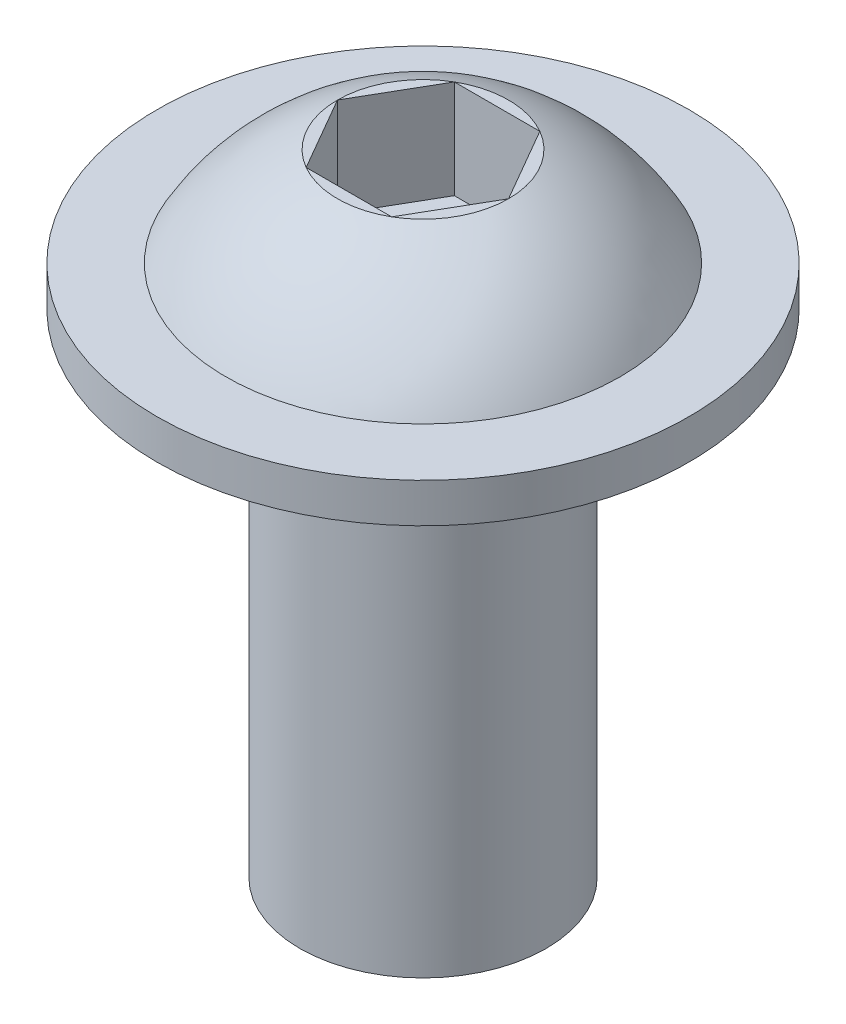
ISO-10303-21;
HEADER;
FILE_DESCRIPTION(('STEP AP214'),'2;1');
FILE_NAME('part.step','',(''),(''),'','','');
FILE_SCHEMA(('AUTOMOTIVE_DESIGN { 1 0 10303 214 1 1 1 1 }'));
ENDSEC;
DATA;
#1=APPLICATION_CONTEXT('core data for automotive mechanical design processes');
#2=APPLICATION_PROTOCOL_DEFINITION('international standard','automotive_design',2000,#1);
#3=PRODUCT_CONTEXT('',#1,'mechanical');
#4=PRODUCT('Part','Part','',(#3));
#5=PRODUCT_RELATED_PRODUCT_CATEGORY('part','',(#4));
#6=PRODUCT_DEFINITION_FORMATION('','',#4);
#7=PRODUCT_DEFINITION_CONTEXT('part definition',#1,'design');
#8=PRODUCT_DEFINITION('design','',#6,#7);
#9=PRODUCT_DEFINITION_SHAPE('','',#8);
#10=(LENGTH_UNIT() NAMED_UNIT(*) SI_UNIT(.MILLI.,.METRE.));
#11=(NAMED_UNIT(*) PLANE_ANGLE_UNIT() SI_UNIT($,.RADIAN.));
#12=(NAMED_UNIT(*) SI_UNIT($,.STERADIAN.) SOLID_ANGLE_UNIT());
#13=UNCERTAINTY_MEASURE_WITH_UNIT(LENGTH_MEASURE(1.E-05),#10,'distance_accuracy_value','');
#14=(GEOMETRIC_REPRESENTATION_CONTEXT(3) GLOBAL_UNCERTAINTY_ASSIGNED_CONTEXT((#13)) GLOBAL_UNIT_ASSIGNED_CONTEXT((#10,
#11,#12)) REPRESENTATION_CONTEXT('',''));
#15=CARTESIAN_POINT('',(0.,0.,0.));
#16=DIRECTION('',(0.,0.,1.));
#17=DIRECTION('',(1.,0.,0.));
#18=AXIS2_PLACEMENT_3D('',#15,#16,#17);
#19=CARTESIAN_POINT('',(2.7569630054343,20.32,0.));
#20=DIRECTION('',(0.,1.,0.));
#21=DIRECTION('',(0.,0.,1.));
#22=AXIS2_PLACEMENT_3D('',#19,#20,#21);
#23=PLANE('',#22);
#24=DIRECTION('',(0.5,0.,-0.866025403784439));
#25=VECTOR('',#24,1.);
#26=CARTESIAN_POINT('',(1.37848150271715,20.32,2.3876));
#27=LINE('',#26,#25);
#28=CARTESIAN_POINT('',(1.37848150271715,20.32,2.3876));
#29=VERTEX_POINT('',#28);
#30=CARTESIAN_POINT('',(2.7569630054343,20.32,0.));
#31=VERTEX_POINT('',#30);
#32=EDGE_CURVE('E47',#29,#31,#27,.T.);
#33=ORIENTED_EDGE('',*,*,#32,.F.);
#34=CARTESIAN_POINT('',(0.,20.32,0.));
#35=DIRECTION('',(0.,-1.,0.));
#36=DIRECTION('',(0.,0.,-1.));
#37=AXIS2_PLACEMENT_3D('',#34,#35,#36);
#38=CIRCLE('',#37,2.7569630054343);
#39=EDGE_CURVE('E144',#31,#29,#38,.T.);
#40=ORIENTED_EDGE('',*,*,#39,.F.);
#41=EDGE_LOOP('',(#33,#40));
#42=FACE_BOUND('',#41,.T.);
#43=ADVANCED_FACE('F32',(#42),#23,.T.);
#44=DIRECTION('',(1.,0.,0.));
#45=VECTOR('',#44,1.);
#46=CARTESIAN_POINT('',(-1.37848150271715,20.32,2.3876));
#47=LINE('',#46,#45);
#48=CARTESIAN_POINT('',(-1.37848150271715,20.32,2.3876));
#49=VERTEX_POINT('',#48);
#50=EDGE_CURVE('E130',#49,#29,#47,.T.);
#51=ORIENTED_EDGE('',*,*,#50,.F.);
#52=EDGE_CURVE('E218',#29,#49,#38,.T.);
#53=ORIENTED_EDGE('',*,*,#52,.F.);
#54=EDGE_LOOP('',(#51,#53));
#55=FACE_BOUND('',#54,.T.);
#56=ADVANCED_FACE('F171',(#55),#23,.T.);
#57=DIRECTION('',(0.5,0.,0.866025403784438));
#58=VECTOR('',#57,1.);
#59=CARTESIAN_POINT('',(-2.7569630054343,20.32,0.));
#60=LINE('',#59,#58);
#61=CARTESIAN_POINT('',(-2.7569630054343,20.32,0.));
#62=VERTEX_POINT('',#61);
#63=EDGE_CURVE('E128',#62,#49,#60,.T.);
#64=ORIENTED_EDGE('',*,*,#63,.F.);
#65=EDGE_CURVE('E219',#49,#62,#38,.T.);
#66=ORIENTED_EDGE('',*,*,#65,.F.);
#67=EDGE_LOOP('',(#64,#66));
#68=FACE_BOUND('',#67,.T.);
#69=ADVANCED_FACE('F178',(#68),#23,.T.);
#70=DIRECTION('',(-0.499999999999999,0.,0.866025403784439));
#71=VECTOR('',#70,1.);
#72=CARTESIAN_POINT('',(-1.37848150271715,20.32,-2.3876));
#73=LINE('',#72,#71);
#74=CARTESIAN_POINT('',(-1.37848150271715,20.32,-2.3876));
#75=VERTEX_POINT('',#74);
#76=EDGE_CURVE('E95',#75,#62,#73,.T.);
#77=ORIENTED_EDGE('',*,*,#76,.F.);
#78=EDGE_CURVE('E213',#62,#75,#38,.T.);
#79=ORIENTED_EDGE('',*,*,#78,.F.);
#80=EDGE_LOOP('',(#77,#79));
#81=FACE_BOUND('',#80,.T.);
#82=ADVANCED_FACE('F195',(#81),#23,.T.);
#83=DIRECTION('',(-1.,0.,0.));
#84=VECTOR('',#83,1.);
#85=CARTESIAN_POINT('',(1.37848150271715,20.32,-2.3876));
#86=LINE('',#85,#84);
#87=CARTESIAN_POINT('',(1.37848150271715,20.32,-2.3876));
#88=VERTEX_POINT('',#87);
#89=EDGE_CURVE('E124',#88,#75,#86,.T.);
#90=ORIENTED_EDGE('',*,*,#89,.F.);
#91=EDGE_CURVE('E134',#75,#88,#38,.T.);
#92=ORIENTED_EDGE('',*,*,#91,.F.);
#93=EDGE_LOOP('',(#90,#92));
#94=FACE_BOUND('',#93,.T.);
#95=ADVANCED_FACE('F186',(#94),#23,.T.);
#96=CARTESIAN_POINT('',(0.,0.,0.));
#97=DIRECTION('',(0.,-1.,0.));
#98=DIRECTION('',(0.,0.,-1.));
#99=AXIS2_PLACEMENT_3D('',#96,#97,#98);
#100=PLANE('',#99);
#101=CARTESIAN_POINT('',(0.,0.,0.));
#102=DIRECTION('',(0.,-1.,0.));
#103=DIRECTION('',(0.,0.,-1.));
#104=AXIS2_PLACEMENT_3D('',#101,#102,#103);
#105=CIRCLE('',#104,3.96875);
#106=CARTESIAN_POINT('',(0.,0.,-3.96875));
#107=VERTEX_POINT('',#106);
#108=EDGE_CURVE('E11',#107,#107,#105,.T.);
#109=ORIENTED_EDGE('',*,*,#108,.T.);
#110=EDGE_LOOP('',(#109));
#111=FACE_BOUND('',#110,.T.);
#112=ADVANCED_FACE('F34',(#111),#100,.T.);
#113=CARTESIAN_POINT('',(0.,0.,0.));
#114=DIRECTION('',(0.,-1.,0.));
#115=DIRECTION('',(0.,0.,-1.));
#116=AXIS2_PLACEMENT_3D('',#113,#114,#115);
#117=CYLINDRICAL_SURFACE('',#116,3.96875);
#118=CARTESIAN_POINT('',(0.,15.875,0.));
#119=DIRECTION('',(0.,-1.,0.));
#120=DIRECTION('',(0.,0.,-1.));
#121=AXIS2_PLACEMENT_3D('',#118,#119,#120);
#122=CIRCLE('',#121,3.96875);
#123=CARTESIAN_POINT('',(0.,15.875,-3.96875));
#124=VERTEX_POINT('',#123);
#125=EDGE_CURVE('E40',#124,#124,#122,.T.);
#126=ORIENTED_EDGE('',*,*,#125,.T.);
#127=EDGE_LOOP('',(#126));
#128=FACE_BOUND('',#127,.T.);
#129=ORIENTED_EDGE('',*,*,#108,.F.);
#130=EDGE_LOOP('',(#129));
#131=FACE_BOUND('',#130,.T.);
#132=ADVANCED_FACE('F155',(#128,#131),#117,.T.);
#133=CARTESIAN_POINT('',(3.96875,15.875,0.));
#134=DIRECTION('',(0.,-1.,0.));
#135=DIRECTION('',(0.,0.,-1.));
#136=AXIS2_PLACEMENT_3D('',#133,#134,#135);
#137=PLANE('',#136);
#138=CARTESIAN_POINT('',(0.,15.875,0.));
#139=DIRECTION('',(0.,-1.,0.));
#140=DIRECTION('',(0.,0.,-1.));
#141=AXIS2_PLACEMENT_3D('',#138,#139,#140);
#142=CIRCLE('',#141,8.5725);
#143=CARTESIAN_POINT('',(0.,15.875,-8.5725));
#144=VERTEX_POINT('',#143);
#145=EDGE_CURVE('E150',#144,#144,#142,.T.);
#146=ORIENTED_EDGE('',*,*,#145,.T.);
#147=EDGE_LOOP('',(#146));
#148=FACE_BOUND('',#147,.T.);
#149=ORIENTED_EDGE('',*,*,#125,.F.);
#150=EDGE_LOOP('',(#149));
#151=FACE_BOUND('',#150,.T.);
#152=ADVANCED_FACE('F158',(#148,#151),#137,.T.);
#153=CARTESIAN_POINT('',(0.,0.,0.));
#154=DIRECTION('',(0.,-1.,0.));
#155=DIRECTION('',(0.,0.,-1.));
#156=AXIS2_PLACEMENT_3D('',#153,#154,#155);
#157=CYLINDRICAL_SURFACE('',#156,8.5725);
#158=CARTESIAN_POINT('',(0.,17.145,0.));
#159=DIRECTION('',(0.,-1.,0.));
#160=DIRECTION('',(0.,0.,-1.));
#161=AXIS2_PLACEMENT_3D('',#158,#159,#160);
#162=CIRCLE('',#161,8.5725);
#163=CARTESIAN_POINT('',(0.,17.145,-8.5725));
#164=VERTEX_POINT('',#163);
#165=EDGE_CURVE('E147',#164,#164,#162,.T.);
#166=ORIENTED_EDGE('',*,*,#165,.T.);
#167=EDGE_LOOP('',(#166));
#168=FACE_BOUND('',#167,.T.);
#169=ORIENTED_EDGE('',*,*,#145,.F.);
#170=EDGE_LOOP('',(#169));
#171=FACE_BOUND('',#170,.T.);
#172=ADVANCED_FACE('F160',(#168,#171),#157,.T.);
#173=CARTESIAN_POINT('',(8.5725,17.145,0.));
#174=DIRECTION('',(0.,1.,0.));
#175=DIRECTION('',(0.,0.,1.));
#176=AXIS2_PLACEMENT_3D('',#173,#174,#175);
#177=PLANE('',#176);
#178=CARTESIAN_POINT('',(0.,17.145,0.));
#179=DIRECTION('',(0.,-1.,0.));
#180=DIRECTION('',(0.,0.,-1.));
#181=AXIS2_PLACEMENT_3D('',#178,#179,#180);
#182=CIRCLE('',#181,6.35);
#183=CARTESIAN_POINT('',(0.,17.145,-6.35));
#184=VERTEX_POINT('',#183);
#185=EDGE_CURVE('E143',#184,#184,#182,.T.);
#186=ORIENTED_EDGE('',*,*,#185,.T.);
#187=EDGE_LOOP('',(#186));
#188=FACE_BOUND('',#187,.T.);
#189=ORIENTED_EDGE('',*,*,#165,.F.);
#190=EDGE_LOOP('',(#189));
#191=FACE_BOUND('',#190,.T.);
#192=ADVANCED_FACE('F167',(#188,#191),#177,.T.);
#193=CARTESIAN_POINT('',(0.,13.5794834666667,0.));
#194=DIRECTION('',(0.,-1.,0.));
#195=DIRECTION('',(1.,0.,0.));
#196=AXIS2_PLACEMENT_3D('',#193,#194,#195);
#197=SPHERICAL_SURFACE('',#196,7.282541324941);
#198=EDGE_CURVE('E140',#88,#31,#38,.T.);
#199=ORIENTED_EDGE('',*,*,#198,.T.);
#200=ORIENTED_EDGE('',*,*,#39,.T.);
#201=ORIENTED_EDGE('',*,*,#52,.T.);
#202=ORIENTED_EDGE('',*,*,#65,.T.);
#203=ORIENTED_EDGE('',*,*,#78,.T.);
#204=ORIENTED_EDGE('',*,*,#91,.T.);
#205=EDGE_LOOP('',(#199,#200,#201,#202,#203,#204));
#206=FACE_BOUND('',#205,.T.);
#207=ORIENTED_EDGE('',*,*,#185,.F.);
#208=EDGE_LOOP('',(#207));
#209=FACE_BOUND('',#208,.T.);
#210=ADVANCED_FACE('F184',(#206,#209),#197,.T.);
#211=DIRECTION('',(-0.5,0.,-0.866025403784439));
#212=VECTOR('',#211,1.);
#213=CARTESIAN_POINT('',(2.7569630054343,20.32,0.));
#214=LINE('',#213,#212);
#215=EDGE_CURVE('E121',#31,#88,#214,.T.);
#216=ORIENTED_EDGE('',*,*,#215,.F.);
#217=ORIENTED_EDGE('',*,*,#198,.F.);
#218=EDGE_LOOP('',(#216,#217));
#219=FACE_BOUND('',#218,.T.);
#220=ADVANCED_FACE('F174',(#219),#23,.T.);
#221=CARTESIAN_POINT('',(1.37848150271715,17.145,2.3876));
#222=DIRECTION('',(0.866025403784439,0.,0.5));
#223=DIRECTION('',(0.5,0.,-0.866025403784439));
#224=AXIS2_PLACEMENT_3D('',#221,#222,#223);
#225=PLANE('',#224);
#226=ORIENTED_EDGE('',*,*,#32,.T.);
#227=DIRECTION('',(0.,1.,0.));
#228=VECTOR('',#227,1.);
#229=CARTESIAN_POINT('',(2.7569630054343,17.145,0.));
#230=LINE('',#229,#228);
#231=CARTESIAN_POINT('',(2.7569630054343,17.145,0.));
#232=VERTEX_POINT('',#231);
#233=EDGE_CURVE('E77',#232,#31,#230,.T.);
#234=ORIENTED_EDGE('',*,*,#233,.F.);
#235=DIRECTION('',(0.5,0.,-0.866025403784439));
#236=VECTOR('',#235,1.);
#237=CARTESIAN_POINT('',(1.37848150271715,17.145,2.3876));
#238=LINE('',#237,#236);
#239=CARTESIAN_POINT('',(1.37848150271715,17.145,2.3876));
#240=VERTEX_POINT('',#239);
#241=EDGE_CURVE('E132',#240,#232,#238,.T.);
#242=ORIENTED_EDGE('',*,*,#241,.F.);
#243=DIRECTION('',(0.,1.,0.));
#244=VECTOR('',#243,1.);
#245=CARTESIAN_POINT('',(1.37848150271715,17.145,2.3876));
#246=LINE('',#245,#244);
#247=EDGE_CURVE('E55',#240,#29,#246,.T.);
#248=ORIENTED_EDGE('',*,*,#247,.T.);
#249=EDGE_LOOP('',(#226,#234,#242,#248));
#250=FACE_BOUND('',#249,.T.);
#251=ADVANCED_FACE('F183',(#250),#225,.F.);
#252=CARTESIAN_POINT('',(-1.37848150271715,17.145,2.3876));
#253=DIRECTION('',(0.,0.,1.));
#254=DIRECTION('',(1.,0.,0.));
#255=AXIS2_PLACEMENT_3D('',#252,#253,#254);
#256=PLANE('',#255);
#257=ORIENTED_EDGE('',*,*,#50,.T.);
#258=ORIENTED_EDGE('',*,*,#247,.F.);
#259=DIRECTION('',(1.,0.,0.));
#260=VECTOR('',#259,1.);
#261=CARTESIAN_POINT('',(-1.37848150271715,17.145,2.3876));
#262=LINE('',#261,#260);
#263=CARTESIAN_POINT('',(-1.37848150271715,17.145,2.3876));
#264=VERTEX_POINT('',#263);
#265=EDGE_CURVE('E107',#264,#240,#262,.T.);
#266=ORIENTED_EDGE('',*,*,#265,.F.);
#267=DIRECTION('',(0.,1.,0.));
#268=VECTOR('',#267,1.);
#269=CARTESIAN_POINT('',(-1.37848150271715,17.145,2.3876));
#270=LINE('',#269,#268);
#271=EDGE_CURVE('E99',#264,#49,#270,.T.);
#272=ORIENTED_EDGE('',*,*,#271,.T.);
#273=EDGE_LOOP('',(#257,#258,#266,#272));
#274=FACE_BOUND('',#273,.T.);
#275=ADVANCED_FACE('F191',(#274),#256,.F.);
#276=CARTESIAN_POINT('',(-2.7569630054343,17.145,0.));
#277=DIRECTION('',(-0.866025403784438,0.,0.5));
#278=DIRECTION('',(0.5,0.,0.866025403784439));
#279=AXIS2_PLACEMENT_3D('',#276,#277,#278);
#280=PLANE('',#279);
#281=ORIENTED_EDGE('',*,*,#63,.T.);
#282=ORIENTED_EDGE('',*,*,#271,.F.);
#283=DIRECTION('',(0.5,0.,0.866025403784438));
#284=VECTOR('',#283,1.);
#285=CARTESIAN_POINT('',(-2.7569630054343,17.145,0.));
#286=LINE('',#285,#284);
#287=CARTESIAN_POINT('',(-2.7569630054343,17.145,0.));
#288=VERTEX_POINT('',#287);
#289=EDGE_CURVE('E103',#288,#264,#286,.T.);
#290=ORIENTED_EDGE('',*,*,#289,.F.);
#291=DIRECTION('',(0.,1.,0.));
#292=VECTOR('',#291,1.);
#293=CARTESIAN_POINT('',(-2.7569630054343,17.145,0.));
#294=LINE('',#293,#292);
#295=EDGE_CURVE('E88',#288,#62,#294,.T.);
#296=ORIENTED_EDGE('',*,*,#295,.T.);
#297=EDGE_LOOP('',(#281,#282,#290,#296));
#298=FACE_BOUND('',#297,.T.);
#299=ADVANCED_FACE('F104',(#298),#280,.F.);
#300=CARTESIAN_POINT('',(-1.37848150271715,17.145,-2.3876));
#301=DIRECTION('',(-0.866025403784439,0.,-0.499999999999999));
#302=DIRECTION('',(-0.5,0.,0.866025403784439));
#303=AXIS2_PLACEMENT_3D('',#300,#301,#302);
#304=PLANE('',#303);
#305=ORIENTED_EDGE('',*,*,#76,.T.);
#306=ORIENTED_EDGE('',*,*,#295,.F.);
#307=DIRECTION('',(-0.499999999999999,0.,0.866025403784439));
#308=VECTOR('',#307,1.);
#309=CARTESIAN_POINT('',(-1.37848150271715,17.145,-2.3876));
#310=LINE('',#309,#308);
#311=CARTESIAN_POINT('',(-1.37848150271715,17.145,-2.3876));
#312=VERTEX_POINT('',#311);
#313=EDGE_CURVE('E92',#312,#288,#310,.T.);
#314=ORIENTED_EDGE('',*,*,#313,.F.);
#315=DIRECTION('',(0.,1.,0.));
#316=VECTOR('',#315,1.);
#317=CARTESIAN_POINT('',(-1.37848150271715,17.145,-2.3876));
#318=LINE('',#317,#316);
#319=EDGE_CURVE('E100',#312,#75,#318,.T.);
#320=ORIENTED_EDGE('',*,*,#319,.T.);
#321=EDGE_LOOP('',(#305,#306,#314,#320));
#322=FACE_BOUND('',#321,.T.);
#323=ADVANCED_FACE('F90',(#322),#304,.F.);
#324=CARTESIAN_POINT('',(1.37848150271715,17.145,-2.3876));
#325=DIRECTION('',(0.,0.,-1.));
#326=DIRECTION('',(-1.,0.,0.));
#327=AXIS2_PLACEMENT_3D('',#324,#325,#326);
#328=PLANE('',#327);
#329=ORIENTED_EDGE('',*,*,#89,.T.);
#330=ORIENTED_EDGE('',*,*,#319,.F.);
#331=DIRECTION('',(-1.,0.,0.));
#332=VECTOR('',#331,1.);
#333=CARTESIAN_POINT('',(1.37848150271715,17.145,-2.3876));
#334=LINE('',#333,#332);
#335=CARTESIAN_POINT('',(1.37848150271715,17.145,-2.3876));
#336=VERTEX_POINT('',#335);
#337=EDGE_CURVE('E113',#336,#312,#334,.T.);
#338=ORIENTED_EDGE('',*,*,#337,.F.);
#339=DIRECTION('',(0.,1.,0.));
#340=VECTOR('',#339,1.);
#341=CARTESIAN_POINT('',(1.37848150271715,17.145,-2.3876));
#342=LINE('',#341,#340);
#343=EDGE_CURVE('E137',#336,#88,#342,.T.);
#344=ORIENTED_EDGE('',*,*,#343,.T.);
#345=EDGE_LOOP('',(#329,#330,#338,#344));
#346=FACE_BOUND('',#345,.T.);
#347=ADVANCED_FACE('F225',(#346),#328,.F.);
#348=CARTESIAN_POINT('',(2.7569630054343,17.145,0.));
#349=DIRECTION('',(0.866025403784439,0.,-0.5));
#350=DIRECTION('',(-0.5,0.,-0.866025403784439));
#351=AXIS2_PLACEMENT_3D('',#348,#349,#350);
#352=PLANE('',#351);
#353=ORIENTED_EDGE('',*,*,#215,.T.);
#354=ORIENTED_EDGE('',*,*,#343,.F.);
#355=DIRECTION('',(-0.5,0.,-0.866025403784439));
#356=VECTOR('',#355,1.);
#357=CARTESIAN_POINT('',(2.7569630054343,17.145,0.));
#358=LINE('',#357,#356);
#359=EDGE_CURVE('E115',#232,#336,#358,.T.);
#360=ORIENTED_EDGE('',*,*,#359,.F.);
#361=ORIENTED_EDGE('',*,*,#233,.T.);
#362=EDGE_LOOP('',(#353,#354,#360,#361));
#363=FACE_BOUND('',#362,.T.);
#364=ADVANCED_FACE('F224',(#363),#352,.F.);
#365=CARTESIAN_POINT('',(4.13544450815145,17.145,-2.3876));
#366=DIRECTION('',(0.,1.,0.));
#367=DIRECTION('',(0.,0.,1.));
#368=AXIS2_PLACEMENT_3D('',#365,#366,#367);
#369=PLANE('',#368);
#370=ORIENTED_EDGE('',*,*,#241,.T.);
#371=ORIENTED_EDGE('',*,*,#359,.T.);
#372=ORIENTED_EDGE('',*,*,#337,.T.);
#373=ORIENTED_EDGE('',*,*,#313,.T.);
#374=ORIENTED_EDGE('',*,*,#289,.T.);
#375=ORIENTED_EDGE('',*,*,#265,.T.);
#376=EDGE_LOOP('',(#370,#371,#372,#373,#374,#375));
#377=FACE_BOUND('',#376,.T.);
#378=ADVANCED_FACE('F110',(#377),#369,.T.);
#379=CLOSED_SHELL('',(#43,#56,#69,#82,#95,#112,#132,#152,#172,#192,#210,#220,#251,#275,#299,
#323,#347,#364,#378));
#380=MANIFOLD_SOLID_BREP('B2',#379);
#381=ADVANCED_BREP_SHAPE_REPRESENTATION('',(#18,#380),#14);
#382=SHAPE_DEFINITION_REPRESENTATION(#9,#381);
ENDSEC;
END-ISO-10303-21;
